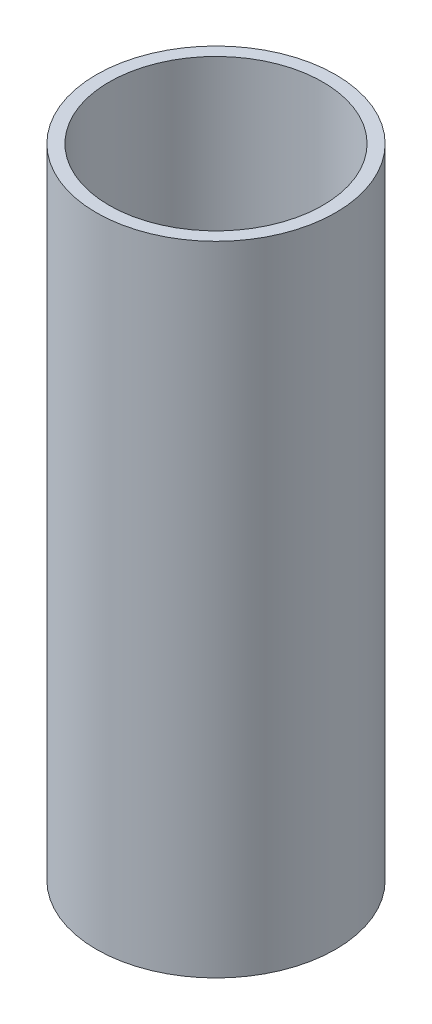
ISO-10303-21;
HEADER;
FILE_DESCRIPTION(('STEP AP214'),'2;1');
FILE_NAME('part.step','',(''),(''),'','','');
FILE_SCHEMA(('AUTOMOTIVE_DESIGN { 1 0 10303 214 1 1 1 1 }'));
ENDSEC;
DATA;
#1=APPLICATION_CONTEXT('core data for automotive mechanical design processes');
#2=APPLICATION_PROTOCOL_DEFINITION('international standard','automotive_design',2000,#1);
#3=PRODUCT_CONTEXT('',#1,'mechanical');
#4=PRODUCT('Part','Part','',(#3));
#5=PRODUCT_RELATED_PRODUCT_CATEGORY('part','',(#4));
#6=PRODUCT_DEFINITION_FORMATION('','',#4);
#7=PRODUCT_DEFINITION_CONTEXT('part definition',#1,'design');
#8=PRODUCT_DEFINITION('design','',#6,#7);
#9=PRODUCT_DEFINITION_SHAPE('','',#8);
#10=(LENGTH_UNIT() NAMED_UNIT(*) SI_UNIT(.MILLI.,.METRE.));
#11=(NAMED_UNIT(*) PLANE_ANGLE_UNIT() SI_UNIT($,.RADIAN.));
#12=(NAMED_UNIT(*) SI_UNIT($,.STERADIAN.) SOLID_ANGLE_UNIT());
#13=UNCERTAINTY_MEASURE_WITH_UNIT(LENGTH_MEASURE(1.E-05),#10,'distance_accuracy_value','');
#14=(GEOMETRIC_REPRESENTATION_CONTEXT(3) GLOBAL_UNCERTAINTY_ASSIGNED_CONTEXT((#13)) GLOBAL_UNIT_ASSIGNED_CONTEXT((#10,
#11,#12)) REPRESENTATION_CONTEXT('',''));
#15=CARTESIAN_POINT('',(0.,0.,0.));
#16=DIRECTION('',(0.,0.,1.));
#17=DIRECTION('',(1.,0.,0.));
#18=AXIS2_PLACEMENT_3D('',#15,#16,#17);
#19=CARTESIAN_POINT('',(0.,200.,0.));
#20=DIRECTION('',(0.,1.,0.));
#21=DIRECTION('',(0.,0.,1.));
#22=AXIS2_PLACEMENT_3D('',#19,#20,#21);
#23=PLANE('',#22);
#24=CARTESIAN_POINT('',(0.,200.,0.));
#25=DIRECTION('',(0.,1.,0.));
#26=DIRECTION('',(0.,0.,1.));
#27=AXIS2_PLACEMENT_3D('',#24,#25,#26);
#28=CIRCLE('',#27,37.5);
#29=CARTESIAN_POINT('',(0.,200.,37.5));
#30=VERTEX_POINT('',#29);
#31=EDGE_CURVE('E10',#30,#30,#28,.T.);
#32=ORIENTED_EDGE('',*,*,#31,.T.);
#33=EDGE_LOOP('',(#32));
#34=FACE_BOUND('',#33,.T.);
#35=CARTESIAN_POINT('',(0.,200.,0.));
#36=DIRECTION('',(0.,1.,0.));
#37=DIRECTION('',(0.,0.,1.));
#38=AXIS2_PLACEMENT_3D('',#35,#36,#37);
#39=CIRCLE('',#38,33.5);
#40=CARTESIAN_POINT('',(0.,200.,33.5));
#41=VERTEX_POINT('',#40);
#42=EDGE_CURVE('E54',#41,#41,#39,.T.);
#43=ORIENTED_EDGE('',*,*,#42,.F.);
#44=EDGE_LOOP('',(#43));
#45=FACE_BOUND('',#44,.T.);
#46=ADVANCED_FACE('F41',(#34,#45),#23,.T.);
#47=CARTESIAN_POINT('',(0.,0.,0.));
#48=DIRECTION('',(0.,1.,0.));
#49=DIRECTION('',(0.,0.,1.));
#50=AXIS2_PLACEMENT_3D('',#47,#48,#49);
#51=PLANE('',#50);
#52=CARTESIAN_POINT('',(0.,0.,0.));
#53=DIRECTION('',(0.,1.,0.));
#54=DIRECTION('',(0.,0.,1.));
#55=AXIS2_PLACEMENT_3D('',#52,#53,#54);
#56=CIRCLE('',#55,37.5);
#57=CARTESIAN_POINT('',(0.,0.,37.5));
#58=VERTEX_POINT('',#57);
#59=EDGE_CURVE('E45',#58,#58,#56,.T.);
#60=ORIENTED_EDGE('',*,*,#59,.F.);
#61=EDGE_LOOP('',(#60));
#62=FACE_BOUND('',#61,.T.);
#63=CARTESIAN_POINT('',(0.,0.,0.));
#64=DIRECTION('',(0.,1.,0.));
#65=DIRECTION('',(0.,0.,1.));
#66=AXIS2_PLACEMENT_3D('',#63,#64,#65);
#67=CIRCLE('',#66,33.5);
#68=CARTESIAN_POINT('',(0.,0.,33.5));
#69=VERTEX_POINT('',#68);
#70=EDGE_CURVE('E56',#69,#69,#67,.T.);
#71=ORIENTED_EDGE('',*,*,#70,.T.);
#72=EDGE_LOOP('',(#71));
#73=FACE_BOUND('',#72,.T.);
#74=ADVANCED_FACE('F68',(#62,#73),#51,.F.);
#75=CARTESIAN_POINT('',(0.,200.,0.));
#76=DIRECTION('',(0.,-1.,0.));
#77=DIRECTION('',(0.,0.,-1.));
#78=AXIS2_PLACEMENT_3D('',#75,#76,#77);
#79=CYLINDRICAL_SURFACE('',#78,37.5);
#80=ORIENTED_EDGE('',*,*,#31,.F.);
#81=EDGE_LOOP('',(#80));
#82=FACE_BOUND('',#81,.T.);
#83=ORIENTED_EDGE('',*,*,#59,.T.);
#84=EDGE_LOOP('',(#83));
#85=FACE_BOUND('',#84,.T.);
#86=ADVANCED_FACE('F43',(#82,#85),#79,.T.);
#87=CARTESIAN_POINT('',(0.,200.,0.));
#88=DIRECTION('',(0.,-1.,0.));
#89=DIRECTION('',(0.,0.,-1.));
#90=AXIS2_PLACEMENT_3D('',#87,#88,#89);
#91=CYLINDRICAL_SURFACE('',#90,33.5);
#92=ORIENTED_EDGE('',*,*,#42,.T.);
#93=EDGE_LOOP('',(#92));
#94=FACE_BOUND('',#93,.T.);
#95=ORIENTED_EDGE('',*,*,#70,.F.);
#96=EDGE_LOOP('',(#95));
#97=FACE_BOUND('',#96,.T.);
#98=ADVANCED_FACE('F64',(#94,#97),#91,.F.);
#99=CLOSED_SHELL('',(#46,#74,#86,#98));
#100=MANIFOLD_SOLID_BREP('B2',#99);
#101=ADVANCED_BREP_SHAPE_REPRESENTATION('',(#18,#100),#14);
#102=SHAPE_DEFINITION_REPRESENTATION(#9,#101);
ENDSEC;
END-ISO-10303-21;
